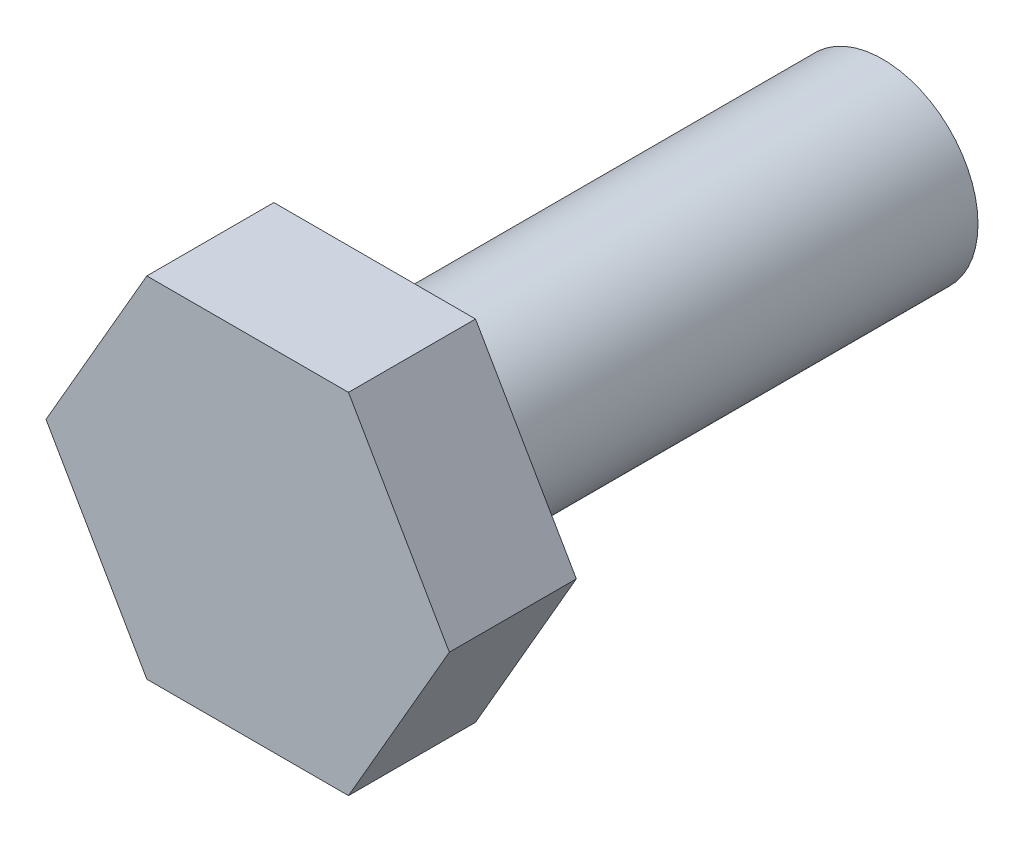
ISO-10303-21;
HEADER;
FILE_DESCRIPTION(('STEP AP214'),'2;1');
FILE_NAME('part.step','',(''),(''),'','','');
FILE_SCHEMA(('AUTOMOTIVE_DESIGN { 1 0 10303 214 1 1 1 1 }'));
ENDSEC;
DATA;
#1=APPLICATION_CONTEXT('core data for automotive mechanical design processes');
#2=APPLICATION_PROTOCOL_DEFINITION('international standard','automotive_design',2000,#1);
#3=PRODUCT_CONTEXT('',#1,'mechanical');
#4=PRODUCT('Part','Part','',(#3));
#5=PRODUCT_RELATED_PRODUCT_CATEGORY('part','',(#4));
#6=PRODUCT_DEFINITION_FORMATION('','',#4);
#7=PRODUCT_DEFINITION_CONTEXT('part definition',#1,'design');
#8=PRODUCT_DEFINITION('design','',#6,#7);
#9=PRODUCT_DEFINITION_SHAPE('','',#8);
#10=(LENGTH_UNIT() NAMED_UNIT(*) SI_UNIT(.MILLI.,.METRE.));
#11=(NAMED_UNIT(*) PLANE_ANGLE_UNIT() SI_UNIT($,.RADIAN.));
#12=(NAMED_UNIT(*) SI_UNIT($,.STERADIAN.) SOLID_ANGLE_UNIT());
#13=UNCERTAINTY_MEASURE_WITH_UNIT(LENGTH_MEASURE(1.E-05),#10,'distance_accuracy_value','');
#14=(GEOMETRIC_REPRESENTATION_CONTEXT(3) GLOBAL_UNCERTAINTY_ASSIGNED_CONTEXT((#13)) GLOBAL_UNIT_ASSIGNED_CONTEXT((#10,
#11,#12)) REPRESENTATION_CONTEXT('',''));
#15=CARTESIAN_POINT('',(0.,0.,0.));
#16=DIRECTION('',(0.,0.,1.));
#17=DIRECTION('',(1.,0.,0.));
#18=AXIS2_PLACEMENT_3D('',#15,#16,#17);
#19=CARTESIAN_POINT('',(0.,0.,-8.));
#20=DIRECTION('',(0.,0.,1.));
#21=DIRECTION('',(1.,0.,0.));
#22=AXIS2_PLACEMENT_3D('',#19,#20,#21);
#23=CYLINDRICAL_SURFACE('',#22,1.5);
#24=CARTESIAN_POINT('',(0.,0.,-8.));
#25=DIRECTION('',(0.,0.,1.));
#26=DIRECTION('',(1.,0.,0.));
#27=AXIS2_PLACEMENT_3D('',#24,#25,#26);
#28=CIRCLE('',#27,1.5);
#29=CARTESIAN_POINT('',(1.5,0.,-8.));
#30=VERTEX_POINT('',#29);
#31=EDGE_CURVE('E11',#30,#30,#28,.T.);
#32=ORIENTED_EDGE('',*,*,#31,.T.);
#33=EDGE_LOOP('',(#32));
#34=FACE_BOUND('',#33,.T.);
#35=CARTESIAN_POINT('',(0.,0.,0.));
#36=DIRECTION('',(0.,0.,1.));
#37=DIRECTION('',(1.,0.,0.));
#38=AXIS2_PLACEMENT_3D('',#35,#36,#37);
#39=CIRCLE('',#38,1.5);
#40=CARTESIAN_POINT('',(1.5,0.,0.));
#41=VERTEX_POINT('',#40);
#42=EDGE_CURVE('E42',#41,#41,#39,.T.);
#43=ORIENTED_EDGE('',*,*,#42,.F.);
#44=EDGE_LOOP('',(#43));
#45=FACE_BOUND('',#44,.T.);
#46=ADVANCED_FACE('F39',(#34,#45),#23,.T.);
#47=CARTESIAN_POINT('',(0.,0.,-8.));
#48=DIRECTION('',(0.,0.,1.));
#49=DIRECTION('',(1.,0.,0.));
#50=AXIS2_PLACEMENT_3D('',#47,#48,#49);
#51=PLANE('',#50);
#52=ORIENTED_EDGE('',*,*,#31,.F.);
#53=EDGE_LOOP('',(#52));
#54=FACE_BOUND('',#53,.T.);
#55=ADVANCED_FACE('F150',(#54),#51,.F.);
#56=CARTESIAN_POINT('',(1.58771324027147,2.75,2.));
#57=DIRECTION('',(0.,-1.,0.));
#58=DIRECTION('',(1.,0.,0.));
#59=AXIS2_PLACEMENT_3D('',#56,#57,#58);
#60=PLANE('',#59);
#61=DIRECTION('',(-1.,0.,0.));
#62=VECTOR('',#61,1.);
#63=CARTESIAN_POINT('',(1.58771324027147,2.75,0.));
#64=LINE('',#63,#62);
#65=CARTESIAN_POINT('',(1.58771324027147,2.75,0.));
#66=VERTEX_POINT('',#65);
#67=CARTESIAN_POINT('',(-1.58771324027147,2.75,0.));
#68=VERTEX_POINT('',#67);
#69=EDGE_CURVE('E124',#66,#68,#64,.T.);
#70=ORIENTED_EDGE('',*,*,#69,.T.);
#71=DIRECTION('',(0.,0.,-1.));
#72=VECTOR('',#71,1.);
#73=CARTESIAN_POINT('',(-1.58771324027147,2.75,2.));
#74=LINE('',#73,#72);
#75=CARTESIAN_POINT('',(-1.58771324027147,2.75,2.));
#76=VERTEX_POINT('',#75);
#77=EDGE_CURVE('E141',#76,#68,#74,.T.);
#78=ORIENTED_EDGE('',*,*,#77,.F.);
#79=DIRECTION('',(-1.,0.,0.));
#80=VECTOR('',#79,1.);
#81=CARTESIAN_POINT('',(1.58771324027147,2.75,2.));
#82=LINE('',#81,#80);
#83=CARTESIAN_POINT('',(1.58771324027147,2.75,2.));
#84=VERTEX_POINT('',#83);
#85=EDGE_CURVE('E134',#84,#76,#82,.T.);
#86=ORIENTED_EDGE('',*,*,#85,.F.);
#87=DIRECTION('',(0.,0.,-1.));
#88=VECTOR('',#87,1.);
#89=CARTESIAN_POINT('',(1.58771324027147,2.75,2.));
#90=LINE('',#89,#88);
#91=EDGE_CURVE('E120',#84,#66,#90,.T.);
#92=ORIENTED_EDGE('',*,*,#91,.T.);
#93=EDGE_LOOP('',(#70,#78,#86,#92));
#94=FACE_BOUND('',#93,.T.);
#95=ADVANCED_FACE('F155',(#94),#60,.F.);
#96=CARTESIAN_POINT('',(-1.58771324027147,2.75,2.));
#97=DIRECTION('',(0.866025403784439,-0.5,0.));
#98=DIRECTION('',(0.5,0.866025403784439,0.));
#99=AXIS2_PLACEMENT_3D('',#96,#97,#98);
#100=PLANE('',#99);
#101=DIRECTION('',(-0.5,-0.866025403784438,0.));
#102=VECTOR('',#101,1.);
#103=CARTESIAN_POINT('',(-1.58771324027147,2.75,0.));
#104=LINE('',#103,#102);
#105=CARTESIAN_POINT('',(-3.17542648054294,0.,0.));
#106=VERTEX_POINT('',#105);
#107=EDGE_CURVE('E127',#68,#106,#104,.T.);
#108=ORIENTED_EDGE('',*,*,#107,.T.);
#109=DIRECTION('',(0.,0.,-1.));
#110=VECTOR('',#109,1.);
#111=CARTESIAN_POINT('',(-3.17542648054294,0.,2.));
#112=LINE('',#111,#110);
#113=CARTESIAN_POINT('',(-3.17542648054294,0.,2.));
#114=VERTEX_POINT('',#113);
#115=EDGE_CURVE('E138',#114,#106,#112,.T.);
#116=ORIENTED_EDGE('',*,*,#115,.F.);
#117=DIRECTION('',(-0.5,-0.866025403784438,0.));
#118=VECTOR('',#117,1.);
#119=CARTESIAN_POINT('',(-1.58771324027147,2.75,2.));
#120=LINE('',#119,#118);
#121=EDGE_CURVE('E93',#76,#114,#120,.T.);
#122=ORIENTED_EDGE('',*,*,#121,.F.);
#123=ORIENTED_EDGE('',*,*,#77,.T.);
#124=EDGE_LOOP('',(#108,#116,#122,#123));
#125=FACE_BOUND('',#124,.T.);
#126=ADVANCED_FACE('F161',(#125),#100,.F.);
#127=CARTESIAN_POINT('',(-3.17542648054294,0.,2.));
#128=DIRECTION('',(0.866025403784439,0.5,0.));
#129=DIRECTION('',(-0.5,0.866025403784439,0.));
#130=AXIS2_PLACEMENT_3D('',#127,#128,#129);
#131=PLANE('',#130);
#132=DIRECTION('',(0.5,-0.866025403784439,0.));
#133=VECTOR('',#132,1.);
#134=CARTESIAN_POINT('',(-3.17542648054294,0.,0.));
#135=LINE('',#134,#133);
#136=CARTESIAN_POINT('',(-1.58771324027147,-2.75,0.));
#137=VERTEX_POINT('',#136);
#138=EDGE_CURVE('E129',#106,#137,#135,.T.);
#139=ORIENTED_EDGE('',*,*,#138,.T.);
#140=DIRECTION('',(0.,0.,-1.));
#141=VECTOR('',#140,1.);
#142=CARTESIAN_POINT('',(-1.58771324027147,-2.75,2.));
#143=LINE('',#142,#141);
#144=CARTESIAN_POINT('',(-1.58771324027147,-2.75,2.));
#145=VERTEX_POINT('',#144);
#146=EDGE_CURVE('E115',#145,#137,#143,.T.);
#147=ORIENTED_EDGE('',*,*,#146,.F.);
#148=DIRECTION('',(0.5,-0.866025403784439,0.));
#149=VECTOR('',#148,1.);
#150=CARTESIAN_POINT('',(-3.17542648054294,0.,2.));
#151=LINE('',#150,#149);
#152=EDGE_CURVE('E106',#114,#145,#151,.T.);
#153=ORIENTED_EDGE('',*,*,#152,.F.);
#154=ORIENTED_EDGE('',*,*,#115,.T.);
#155=EDGE_LOOP('',(#139,#147,#153,#154));
#156=FACE_BOUND('',#155,.T.);
#157=ADVANCED_FACE('F167',(#156),#131,.F.);
#158=CARTESIAN_POINT('',(-1.58771324027147,-2.75,2.));
#159=DIRECTION('',(0.,1.,0.));
#160=DIRECTION('',(0.,0.,1.));
#161=AXIS2_PLACEMENT_3D('',#158,#159,#160);
#162=PLANE('',#161);
#163=DIRECTION('',(1.,0.,0.));
#164=VECTOR('',#163,1.);
#165=CARTESIAN_POINT('',(-1.58771324027147,-2.75,0.));
#166=LINE('',#165,#164);
#167=CARTESIAN_POINT('',(1.58771324027147,-2.75,0.));
#168=VERTEX_POINT('',#167);
#169=EDGE_CURVE('E114',#137,#168,#166,.T.);
#170=ORIENTED_EDGE('',*,*,#169,.T.);
#171=DIRECTION('',(0.,0.,-1.));
#172=VECTOR('',#171,1.);
#173=CARTESIAN_POINT('',(1.58771324027147,-2.75,2.));
#174=LINE('',#173,#172);
#175=CARTESIAN_POINT('',(1.58771324027147,-2.75,2.));
#176=VERTEX_POINT('',#175);
#177=EDGE_CURVE('E111',#176,#168,#174,.T.);
#178=ORIENTED_EDGE('',*,*,#177,.F.);
#179=DIRECTION('',(1.,0.,0.));
#180=VECTOR('',#179,1.);
#181=CARTESIAN_POINT('',(-1.58771324027147,-2.75,2.));
#182=LINE('',#181,#180);
#183=EDGE_CURVE('E100',#145,#176,#182,.T.);
#184=ORIENTED_EDGE('',*,*,#183,.F.);
#185=ORIENTED_EDGE('',*,*,#146,.T.);
#186=EDGE_LOOP('',(#170,#178,#184,#185));
#187=FACE_BOUND('',#186,.T.);
#188=ADVANCED_FACE('F112',(#187),#162,.F.);
#189=CARTESIAN_POINT('',(1.58771324027147,-2.75,2.));
#190=DIRECTION('',(-0.866025403784439,0.5,0.));
#191=DIRECTION('',(-0.5,-0.866025403784439,0.));
#192=AXIS2_PLACEMENT_3D('',#189,#190,#191);
#193=PLANE('',#192);
#194=DIRECTION('',(0.5,0.866025403784439,0.));
#195=VECTOR('',#194,1.);
#196=CARTESIAN_POINT('',(1.58771324027147,-2.75,0.));
#197=LINE('',#196,#195);
#198=CARTESIAN_POINT('',(3.17542648054294,0.,0.));
#199=VERTEX_POINT('',#198);
#200=EDGE_CURVE('E78',#168,#199,#197,.T.);
#201=ORIENTED_EDGE('',*,*,#200,.T.);
#202=DIRECTION('',(0.,0.,-1.));
#203=VECTOR('',#202,1.);
#204=CARTESIAN_POINT('',(3.17542648054294,0.,2.));
#205=LINE('',#204,#203);
#206=CARTESIAN_POINT('',(3.17542648054294,0.,2.));
#207=VERTEX_POINT('',#206);
#208=EDGE_CURVE('E116',#207,#199,#205,.T.);
#209=ORIENTED_EDGE('',*,*,#208,.F.);
#210=DIRECTION('',(0.5,0.866025403784439,0.));
#211=VECTOR('',#210,1.);
#212=CARTESIAN_POINT('',(1.58771324027147,-2.75,2.));
#213=LINE('',#212,#211);
#214=EDGE_CURVE('E104',#176,#207,#213,.T.);
#215=ORIENTED_EDGE('',*,*,#214,.F.);
#216=ORIENTED_EDGE('',*,*,#177,.T.);
#217=EDGE_LOOP('',(#201,#209,#215,#216));
#218=FACE_BOUND('',#217,.T.);
#219=ADVANCED_FACE('F118',(#218),#193,.F.);
#220=CARTESIAN_POINT('',(3.17542648054294,0.,2.));
#221=DIRECTION('',(-0.866025403784439,-0.5,0.));
#222=DIRECTION('',(0.5,-0.866025403784439,0.));
#223=AXIS2_PLACEMENT_3D('',#220,#221,#222);
#224=PLANE('',#223);
#225=DIRECTION('',(-0.5,0.866025403784439,0.));
#226=VECTOR('',#225,1.);
#227=CARTESIAN_POINT('',(3.17542648054294,0.,0.));
#228=LINE('',#227,#226);
#229=EDGE_CURVE('E84',#199,#66,#228,.T.);
#230=ORIENTED_EDGE('',*,*,#229,.T.);
#231=ORIENTED_EDGE('',*,*,#91,.F.);
#232=DIRECTION('',(-0.5,0.866025403784439,0.));
#233=VECTOR('',#232,1.);
#234=CARTESIAN_POINT('',(3.17542648054294,0.,2.));
#235=LINE('',#234,#233);
#236=EDGE_CURVE('E55',#207,#84,#235,.T.);
#237=ORIENTED_EDGE('',*,*,#236,.F.);
#238=ORIENTED_EDGE('',*,*,#208,.T.);
#239=EDGE_LOOP('',(#230,#231,#237,#238));
#240=FACE_BOUND('',#239,.T.);
#241=ADVANCED_FACE('F175',(#240),#224,.F.);
#242=CARTESIAN_POINT('',(-4.76313972081441,2.75,2.));
#243=DIRECTION('',(0.,0.,1.));
#244=DIRECTION('',(1.,0.,0.));
#245=AXIS2_PLACEMENT_3D('',#242,#243,#244);
#246=PLANE('',#245);
#247=ORIENTED_EDGE('',*,*,#85,.T.);
#248=ORIENTED_EDGE('',*,*,#121,.T.);
#249=ORIENTED_EDGE('',*,*,#152,.T.);
#250=ORIENTED_EDGE('',*,*,#183,.T.);
#251=ORIENTED_EDGE('',*,*,#214,.T.);
#252=ORIENTED_EDGE('',*,*,#236,.T.);
#253=EDGE_LOOP('',(#247,#248,#249,#250,#251,#252));
#254=FACE_BOUND('',#253,.T.);
#255=ADVANCED_FACE('F102',(#254),#246,.T.);
#256=CARTESIAN_POINT('',(-4.76313972081441,2.75,0.));
#257=DIRECTION('',(0.,0.,1.));
#258=DIRECTION('',(1.,0.,0.));
#259=AXIS2_PLACEMENT_3D('',#256,#257,#258);
#260=PLANE('',#259);
#261=ORIENTED_EDGE('',*,*,#42,.T.);
#262=EDGE_LOOP('',(#261));
#263=FACE_BOUND('',#262,.T.);
#264=ORIENTED_EDGE('',*,*,#69,.F.);
#265=ORIENTED_EDGE('',*,*,#229,.F.);
#266=ORIENTED_EDGE('',*,*,#200,.F.);
#267=ORIENTED_EDGE('',*,*,#169,.F.);
#268=ORIENTED_EDGE('',*,*,#138,.F.);
#269=ORIENTED_EDGE('',*,*,#107,.F.);
#270=EDGE_LOOP('',(#264,#265,#266,#267,#268,#269));
#271=FACE_BOUND('',#270,.T.);
#272=ADVANCED_FACE('F146',(#263,#271),#260,.F.);
#273=CLOSED_SHELL('',(#46,#55,#95,#126,#157,#188,#219,#241,#255,#272));
#274=MANIFOLD_SOLID_BREP('B2',#273);
#275=ADVANCED_BREP_SHAPE_REPRESENTATION('',(#18,#274),#14);
#276=SHAPE_DEFINITION_REPRESENTATION(#9,#275);
ENDSEC;
END-ISO-10303-21;
